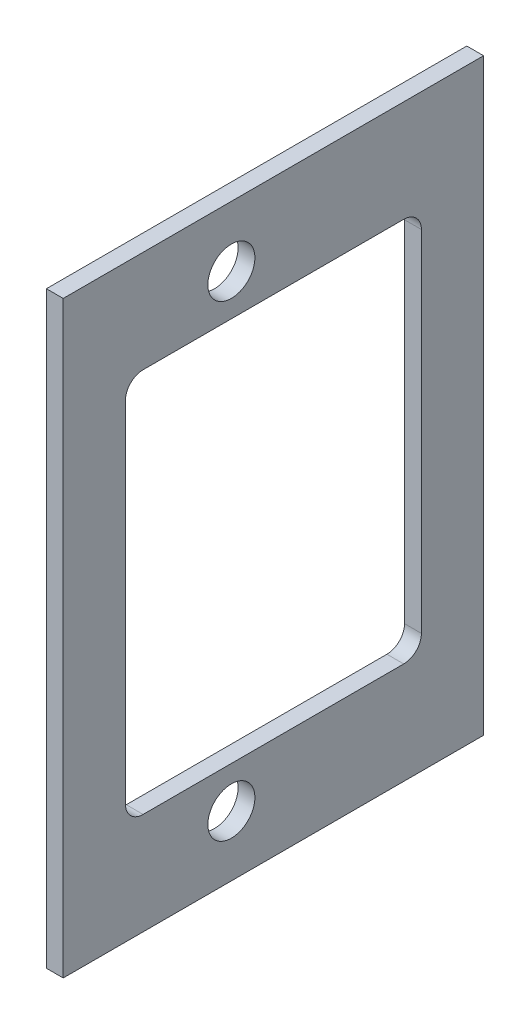
ISO-10303-21;
HEADER;
FILE_DESCRIPTION(('STEP AP214'),'2;1');
FILE_NAME('part.step','',(''),(''),'','','');
FILE_SCHEMA(('AUTOMOTIVE_DESIGN { 1 0 10303 214 1 1 1 1 }'));
ENDSEC;
DATA;
#1=APPLICATION_CONTEXT('core data for automotive mechanical design processes');
#2=APPLICATION_PROTOCOL_DEFINITION('international standard','automotive_design',2000,#1);
#3=PRODUCT_CONTEXT('',#1,'mechanical');
#4=PRODUCT('Part','Part','',(#3));
#5=PRODUCT_RELATED_PRODUCT_CATEGORY('part','',(#4));
#6=PRODUCT_DEFINITION_FORMATION('','',#4);
#7=PRODUCT_DEFINITION_CONTEXT('part definition',#1,'design');
#8=PRODUCT_DEFINITION('design','',#6,#7);
#9=PRODUCT_DEFINITION_SHAPE('','',#8);
#10=(LENGTH_UNIT() NAMED_UNIT(*) SI_UNIT(.MILLI.,.METRE.));
#11=(NAMED_UNIT(*) PLANE_ANGLE_UNIT() SI_UNIT($,.RADIAN.));
#12=(NAMED_UNIT(*) SI_UNIT($,.STERADIAN.) SOLID_ANGLE_UNIT());
#13=UNCERTAINTY_MEASURE_WITH_UNIT(LENGTH_MEASURE(1.E-05),#10,'distance_accuracy_value','');
#14=(GEOMETRIC_REPRESENTATION_CONTEXT(3) GLOBAL_UNCERTAINTY_ASSIGNED_CONTEXT((#13)) GLOBAL_UNIT_ASSIGNED_CONTEXT((#10,
#11,#12)) REPRESENTATION_CONTEXT('',''));
#15=CARTESIAN_POINT('',(0.,0.,0.));
#16=DIRECTION('',(0.,0.,1.));
#17=DIRECTION('',(1.,0.,0.));
#18=AXIS2_PLACEMENT_3D('',#15,#16,#17);
#19=CARTESIAN_POINT('',(1.,-17.5,12.5));
#20=DIRECTION('',(0.,0.,-1.));
#21=DIRECTION('',(-1.,0.,0.));
#22=AXIS2_PLACEMENT_3D('',#19,#20,#21);
#23=PLANE('',#22);
#24=DIRECTION('',(0.,-1.,0.));
#25=VECTOR('',#24,1.);
#26=CARTESIAN_POINT('',(0.,-17.5,12.5));
#27=LINE('',#26,#25);
#28=CARTESIAN_POINT('',(0.,17.5,12.5));
#29=VERTEX_POINT('',#28);
#30=CARTESIAN_POINT('',(0.,-17.5,12.5));
#31=VERTEX_POINT('',#30);
#32=EDGE_CURVE('E202',#29,#31,#27,.T.);
#33=ORIENTED_EDGE('',*,*,#32,.T.);
#34=DIRECTION('',(-1.,0.,0.));
#35=VECTOR('',#34,1.);
#36=CARTESIAN_POINT('',(1.,-17.5,12.5));
#37=LINE('',#36,#35);
#38=CARTESIAN_POINT('',(1.,-17.5,12.5));
#39=VERTEX_POINT('',#38);
#40=EDGE_CURVE('E11',#39,#31,#37,.T.);
#41=ORIENTED_EDGE('',*,*,#40,.F.);
#42=DIRECTION('',(0.,-1.,0.));
#43=VECTOR('',#42,1.);
#44=CARTESIAN_POINT('',(1.,-17.5,12.5));
#45=LINE('',#44,#43);
#46=CARTESIAN_POINT('',(1.,17.5,12.5));
#47=VERTEX_POINT('',#46);
#48=EDGE_CURVE('E203',#47,#39,#45,.T.);
#49=ORIENTED_EDGE('',*,*,#48,.F.);
#50=DIRECTION('',(-1.,0.,0.));
#51=VECTOR('',#50,1.);
#52=CARTESIAN_POINT('',(1.,17.5,12.5));
#53=LINE('',#52,#51);
#54=EDGE_CURVE('E217',#47,#29,#53,.T.);
#55=ORIENTED_EDGE('',*,*,#54,.T.);
#56=EDGE_LOOP('',(#33,#41,#49,#55));
#57=FACE_BOUND('',#56,.T.);
#58=ADVANCED_FACE('F38',(#57),#23,.F.);
#59=CARTESIAN_POINT('',(1.,-17.5,-12.5));
#60=DIRECTION('',(0.,1.,0.));
#61=DIRECTION('',(0.,0.,1.));
#62=AXIS2_PLACEMENT_3D('',#59,#60,#61);
#63=PLANE('',#62);
#64=DIRECTION('',(0.,0.,-1.));
#65=VECTOR('',#64,1.);
#66=CARTESIAN_POINT('',(0.,-17.5,-12.5));
#67=LINE('',#66,#65);
#68=CARTESIAN_POINT('',(0.,-17.5,-12.5));
#69=VERTEX_POINT('',#68);
#70=EDGE_CURVE('E221',#31,#69,#67,.T.);
#71=ORIENTED_EDGE('',*,*,#70,.T.);
#72=DIRECTION('',(-1.,0.,0.));
#73=VECTOR('',#72,1.);
#74=CARTESIAN_POINT('',(1.,-17.5,-12.5));
#75=LINE('',#74,#73);
#76=CARTESIAN_POINT('',(1.,-17.5,-12.5));
#77=VERTEX_POINT('',#76);
#78=EDGE_CURVE('E46',#77,#69,#75,.T.);
#79=ORIENTED_EDGE('',*,*,#78,.F.);
#80=DIRECTION('',(0.,0.,-1.));
#81=VECTOR('',#80,1.);
#82=CARTESIAN_POINT('',(1.,-17.5,-12.5));
#83=LINE('',#82,#81);
#84=EDGE_CURVE('E207',#39,#77,#83,.T.);
#85=ORIENTED_EDGE('',*,*,#84,.F.);
#86=ORIENTED_EDGE('',*,*,#40,.T.);
#87=EDGE_LOOP('',(#71,#79,#85,#86));
#88=FACE_BOUND('',#87,.T.);
#89=ADVANCED_FACE('F256',(#88),#63,.F.);
#90=CARTESIAN_POINT('',(1.,-17.5,-12.5));
#91=DIRECTION('',(0.,0.,1.));
#92=DIRECTION('',(1.,0.,0.));
#93=AXIS2_PLACEMENT_3D('',#90,#91,#92);
#94=PLANE('',#93);
#95=DIRECTION('',(0.,1.,0.));
#96=VECTOR('',#95,1.);
#97=CARTESIAN_POINT('',(0.,-17.5,-12.5));
#98=LINE('',#97,#96);
#99=CARTESIAN_POINT('',(0.,17.5,-12.5));
#100=VERTEX_POINT('',#99);
#101=EDGE_CURVE('E224',#69,#100,#98,.T.);
#102=ORIENTED_EDGE('',*,*,#101,.T.);
#103=DIRECTION('',(-1.,0.,0.));
#104=VECTOR('',#103,1.);
#105=CARTESIAN_POINT('',(1.,17.5,-12.5));
#106=LINE('',#105,#104);
#107=CARTESIAN_POINT('',(1.,17.5,-12.5));
#108=VERTEX_POINT('',#107);
#109=EDGE_CURVE('E232',#108,#100,#106,.T.);
#110=ORIENTED_EDGE('',*,*,#109,.F.);
#111=DIRECTION('',(0.,1.,0.));
#112=VECTOR('',#111,1.);
#113=CARTESIAN_POINT('',(1.,-17.5,-12.5));
#114=LINE('',#113,#112);
#115=EDGE_CURVE('E211',#77,#108,#114,.T.);
#116=ORIENTED_EDGE('',*,*,#115,.F.);
#117=ORIENTED_EDGE('',*,*,#78,.T.);
#118=EDGE_LOOP('',(#102,#110,#116,#117));
#119=FACE_BOUND('',#118,.T.);
#120=ADVANCED_FACE('F242',(#119),#94,.F.);
#121=CARTESIAN_POINT('',(1.,17.5,-12.5));
#122=DIRECTION('',(0.,-1.,0.));
#123=DIRECTION('',(0.,0.,-1.));
#124=AXIS2_PLACEMENT_3D('',#121,#122,#123);
#125=PLANE('',#124);
#126=DIRECTION('',(0.,0.,1.));
#127=VECTOR('',#126,1.);
#128=CARTESIAN_POINT('',(0.,17.5,-12.5));
#129=LINE('',#128,#127);
#130=EDGE_CURVE('E208',#100,#29,#129,.T.);
#131=ORIENTED_EDGE('',*,*,#130,.T.);
#132=ORIENTED_EDGE('',*,*,#54,.F.);
#133=DIRECTION('',(0.,0.,1.));
#134=VECTOR('',#133,1.);
#135=CARTESIAN_POINT('',(1.,17.5,-12.5));
#136=LINE('',#135,#134);
#137=EDGE_CURVE('E214',#108,#47,#136,.T.);
#138=ORIENTED_EDGE('',*,*,#137,.F.);
#139=ORIENTED_EDGE('',*,*,#109,.T.);
#140=EDGE_LOOP('',(#131,#132,#138,#139));
#141=FACE_BOUND('',#140,.T.);
#142=ADVANCED_FACE('F251',(#141),#125,.F.);
#143=CARTESIAN_POINT('',(1.,0.,0.));
#144=DIRECTION('',(1.,0.,0.));
#145=DIRECTION('',(0.,0.,-1.));
#146=AXIS2_PLACEMENT_3D('',#143,#144,#145);
#147=PLANE('',#146);
#148=CARTESIAN_POINT('',(1.,-13.8999999999999,2.5));
#149=DIRECTION('',(1.,0.,0.));
#150=DIRECTION('',(0.,0.,-1.));
#151=AXIS2_PLACEMENT_3D('',#148,#149,#150);
#152=CIRCLE('',#151,1.4);
#153=CARTESIAN_POINT('',(0.999999999999997,-13.8999999999999,3.9));
#154=VERTEX_POINT('',#153);
#155=EDGE_CURVE('E320',#154,#154,#152,.F.);
#156=ORIENTED_EDGE('',*,*,#155,.T.);
#157=EDGE_LOOP('',(#156));
#158=FACE_BOUND('',#157,.T.);
#159=CARTESIAN_POINT('',(1.,13.9,2.49999999999995));
#160=DIRECTION('',(1.,0.,0.));
#161=DIRECTION('',(0.,0.,-1.));
#162=AXIS2_PLACEMENT_3D('',#159,#160,#161);
#163=CIRCLE('',#162,1.40000000000004);
#164=CARTESIAN_POINT('',(0.999999999999997,13.9,3.89999999999999));
#165=VERTEX_POINT('',#164);
#166=EDGE_CURVE('E313',#165,#165,#163,.F.);
#167=ORIENTED_EDGE('',*,*,#166,.T.);
#168=EDGE_LOOP('',(#167));
#169=FACE_BOUND('',#168,.T.);
#170=DIRECTION('',(0.,0.,1.));
#171=VECTOR('',#170,1.);
#172=CARTESIAN_POINT('',(1.,-11.45,7.74999999999998));
#173=LINE('',#172,#171);
#174=CARTESIAN_POINT('',(1.,-11.45,-7.74999999999998));
#175=VERTEX_POINT('',#174);
#176=CARTESIAN_POINT('',(1.,-11.45,7.74999999999998));
#177=VERTEX_POINT('',#176);
#178=EDGE_CURVE('E142',#175,#177,#173,.T.);
#179=ORIENTED_EDGE('',*,*,#178,.T.);
#180=CARTESIAN_POINT('',(1.,-10.4,7.74999999999998));
#181=DIRECTION('',(1.,0.,0.));
#182=DIRECTION('',(0.,0.,-1.));
#183=AXIS2_PLACEMENT_3D('',#180,#181,#182);
#184=CIRCLE('',#183,1.04999999999999);
#185=CARTESIAN_POINT('',(1.,-10.4,8.79999999999997));
#186=VERTEX_POINT('',#185);
#187=EDGE_CURVE('E128',#177,#186,#184,.F.);
#188=ORIENTED_EDGE('',*,*,#187,.T.);
#189=DIRECTION('',(0.,1.,0.));
#190=VECTOR('',#189,1.);
#191=CARTESIAN_POINT('',(1.,10.4,8.79999999999997));
#192=LINE('',#191,#190);
#193=CARTESIAN_POINT('',(1.,10.4,8.79999999999997));
#194=VERTEX_POINT('',#193);
#195=EDGE_CURVE('E185',#186,#194,#192,.T.);
#196=ORIENTED_EDGE('',*,*,#195,.T.);
#197=CARTESIAN_POINT('',(1.,10.4,7.74999999999998));
#198=DIRECTION('',(1.,0.,0.));
#199=DIRECTION('',(0.,0.,-1.));
#200=AXIS2_PLACEMENT_3D('',#197,#198,#199);
#201=CIRCLE('',#200,1.05000000000002);
#202=CARTESIAN_POINT('',(1.,11.45,7.74999999999998));
#203=VERTEX_POINT('',#202);
#204=EDGE_CURVE('E180',#194,#203,#201,.F.);
#205=ORIENTED_EDGE('',*,*,#204,.T.);
#206=DIRECTION('',(0.,0.,-1.));
#207=VECTOR('',#206,1.);
#208=CARTESIAN_POINT('',(1.,11.45,-7.75000000000003));
#209=LINE('',#208,#207);
#210=CARTESIAN_POINT('',(1.,11.45,-7.75000000000003));
#211=VERTEX_POINT('',#210);
#212=EDGE_CURVE('E175',#203,#211,#209,.T.);
#213=ORIENTED_EDGE('',*,*,#212,.T.);
#214=CARTESIAN_POINT('',(1.,10.4,-7.75000000000003));
#215=DIRECTION('',(1.,0.,0.));
#216=DIRECTION('',(0.,0.,-1.));
#217=AXIS2_PLACEMENT_3D('',#214,#215,#216);
#218=CIRCLE('',#217,1.05);
#219=CARTESIAN_POINT('',(1.,10.4,-8.80000000000003));
#220=VERTEX_POINT('',#219);
#221=EDGE_CURVE('E170',#211,#220,#218,.F.);
#222=ORIENTED_EDGE('',*,*,#221,.T.);
#223=DIRECTION('',(0.,-1.,0.));
#224=VECTOR('',#223,1.);
#225=CARTESIAN_POINT('',(1.,10.4,-8.80000000000003));
#226=LINE('',#225,#224);
#227=CARTESIAN_POINT('',(1.,-10.4,-8.80000000000003));
#228=VERTEX_POINT('',#227);
#229=EDGE_CURVE('E166',#220,#228,#226,.T.);
#230=ORIENTED_EDGE('',*,*,#229,.T.);
#231=CARTESIAN_POINT('',(1.,-10.4,-7.75000000000003));
#232=DIRECTION('',(1.,0.,0.));
#233=DIRECTION('',(0.,0.,-1.));
#234=AXIS2_PLACEMENT_3D('',#231,#232,#233);
#235=CIRCLE('',#234,1.05);
#236=EDGE_CURVE('E152',#228,#175,#235,.F.);
#237=ORIENTED_EDGE('',*,*,#236,.T.);
#238=EDGE_LOOP('',(#179,#188,#196,#205,#213,#222,#230,#237));
#239=FACE_BOUND('',#238,.T.);
#240=ORIENTED_EDGE('',*,*,#48,.T.);
#241=ORIENTED_EDGE('',*,*,#84,.T.);
#242=ORIENTED_EDGE('',*,*,#115,.T.);
#243=ORIENTED_EDGE('',*,*,#137,.T.);
#244=EDGE_LOOP('',(#240,#241,#242,#243));
#245=FACE_BOUND('',#244,.T.);
#246=ADVANCED_FACE('F149',(#158,#169,#239,#245),#147,.T.);
#247=CARTESIAN_POINT('',(0.,0.,0.));
#248=DIRECTION('',(1.,0.,0.));
#249=DIRECTION('',(0.,0.,-1.));
#250=AXIS2_PLACEMENT_3D('',#247,#248,#249);
#251=PLANE('',#250);
#252=CARTESIAN_POINT('',(0.,-13.8999999999999,2.5));
#253=DIRECTION('',(-1.,0.,0.));
#254=DIRECTION('',(0.,0.,1.));
#255=AXIS2_PLACEMENT_3D('',#252,#253,#254);
#256=CIRCLE('',#255,1.4);
#257=CARTESIAN_POINT('',(0.,-13.8999999999999,3.9));
#258=VERTEX_POINT('',#257);
#259=EDGE_CURVE('E323',#258,#258,#256,.T.);
#260=ORIENTED_EDGE('',*,*,#259,.F.);
#261=EDGE_LOOP('',(#260));
#262=FACE_BOUND('',#261,.T.);
#263=CARTESIAN_POINT('',(0.,13.9,2.49999999999995));
#264=DIRECTION('',(-1.,0.,0.));
#265=DIRECTION('',(0.,0.,1.));
#266=AXIS2_PLACEMENT_3D('',#263,#264,#265);
#267=CIRCLE('',#266,1.40000000000004);
#268=CARTESIAN_POINT('',(0.,13.9,3.89999999999999));
#269=VERTEX_POINT('',#268);
#270=EDGE_CURVE('E310',#269,#269,#267,.T.);
#271=ORIENTED_EDGE('',*,*,#270,.F.);
#272=EDGE_LOOP('',(#271));
#273=FACE_BOUND('',#272,.T.);
#274=CARTESIAN_POINT('',(0.,-10.4,7.74999999999998));
#275=DIRECTION('',(-1.,0.,0.));
#276=DIRECTION('',(0.,0.,1.));
#277=AXIS2_PLACEMENT_3D('',#274,#275,#276);
#278=CIRCLE('',#277,1.04999999999999);
#279=CARTESIAN_POINT('',(0.,-11.45,7.74999999999998));
#280=VERTEX_POINT('',#279);
#281=CARTESIAN_POINT('',(0.,-10.4,8.79999999999997));
#282=VERTEX_POINT('',#281);
#283=EDGE_CURVE('E345',#280,#282,#278,.T.);
#284=ORIENTED_EDGE('',*,*,#283,.F.);
#285=DIRECTION('',(0.,0.,1.));
#286=VECTOR('',#285,1.);
#287=CARTESIAN_POINT('',(0.,-11.45,7.74999999999998));
#288=LINE('',#287,#286);
#289=CARTESIAN_POINT('',(0.,-11.45,-7.74999999999998));
#290=VERTEX_POINT('',#289);
#291=EDGE_CURVE('E145',#290,#280,#288,.T.);
#292=ORIENTED_EDGE('',*,*,#291,.F.);
#293=CARTESIAN_POINT('',(0.,-10.4,-7.75000000000003));
#294=DIRECTION('',(-1.,0.,0.));
#295=DIRECTION('',(0.,0.,1.));
#296=AXIS2_PLACEMENT_3D('',#293,#294,#295);
#297=CIRCLE('',#296,1.05);
#298=CARTESIAN_POINT('',(0.,-10.4,-8.80000000000003));
#299=VERTEX_POINT('',#298);
#300=EDGE_CURVE('E161',#299,#290,#297,.T.);
#301=ORIENTED_EDGE('',*,*,#300,.F.);
#302=DIRECTION('',(0.,-1.,0.));
#303=VECTOR('',#302,1.);
#304=CARTESIAN_POINT('',(0.,10.4,-8.80000000000003));
#305=LINE('',#304,#303);
#306=CARTESIAN_POINT('',(0.,10.4,-8.80000000000003));
#307=VERTEX_POINT('',#306);
#308=EDGE_CURVE('E61',#307,#299,#305,.T.);
#309=ORIENTED_EDGE('',*,*,#308,.F.);
#310=CARTESIAN_POINT('',(0.,10.4,-7.75000000000003));
#311=DIRECTION('',(-1.,0.,0.));
#312=DIRECTION('',(0.,0.,1.));
#313=AXIS2_PLACEMENT_3D('',#310,#311,#312);
#314=CIRCLE('',#313,1.05);
#315=CARTESIAN_POINT('',(0.,11.45,-7.75000000000003));
#316=VERTEX_POINT('',#315);
#317=EDGE_CURVE('E157',#316,#307,#314,.T.);
#318=ORIENTED_EDGE('',*,*,#317,.F.);
#319=DIRECTION('',(0.,0.,-1.));
#320=VECTOR('',#319,1.);
#321=CARTESIAN_POINT('',(0.,11.45,-7.75000000000003));
#322=LINE('',#321,#320);
#323=CARTESIAN_POINT('',(0.,11.45,7.74999999999998));
#324=VERTEX_POINT('',#323);
#325=EDGE_CURVE('E333',#324,#316,#322,.T.);
#326=ORIENTED_EDGE('',*,*,#325,.F.);
#327=CARTESIAN_POINT('',(0.,10.4,7.74999999999998));
#328=DIRECTION('',(-1.,0.,0.));
#329=DIRECTION('',(0.,0.,1.));
#330=AXIS2_PLACEMENT_3D('',#327,#328,#329);
#331=CIRCLE('',#330,1.05000000000002);
#332=CARTESIAN_POINT('',(0.,10.4,8.79999999999997));
#333=VERTEX_POINT('',#332);
#334=EDGE_CURVE('E337',#333,#324,#331,.T.);
#335=ORIENTED_EDGE('',*,*,#334,.F.);
#336=DIRECTION('',(0.,1.,0.));
#337=VECTOR('',#336,1.);
#338=CARTESIAN_POINT('',(0.,10.4,8.79999999999997));
#339=LINE('',#338,#337);
#340=EDGE_CURVE('E341',#282,#333,#339,.T.);
#341=ORIENTED_EDGE('',*,*,#340,.F.);
#342=EDGE_LOOP('',(#284,#292,#301,#309,#318,#326,#335,#341));
#343=FACE_BOUND('',#342,.T.);
#344=ORIENTED_EDGE('',*,*,#32,.F.);
#345=ORIENTED_EDGE('',*,*,#130,.F.);
#346=ORIENTED_EDGE('',*,*,#101,.F.);
#347=ORIENTED_EDGE('',*,*,#70,.F.);
#348=EDGE_LOOP('',(#344,#345,#346,#347));
#349=FACE_BOUND('',#348,.T.);
#350=ADVANCED_FACE('F248',(#262,#273,#343,#349),#251,.F.);
#351=CARTESIAN_POINT('',(29.8820013156984,-11.45,7.74999999999998));
#352=DIRECTION('',(0.,-1.,0.));
#353=DIRECTION('',(0.,0.,-1.));
#354=AXIS2_PLACEMENT_3D('',#351,#352,#353);
#355=PLANE('',#354);
#356=DIRECTION('',(-1.,0.,0.));
#357=VECTOR('',#356,1.);
#358=CARTESIAN_POINT('',(29.8820013156984,-11.45,-7.74999999999998));
#359=LINE('',#358,#357);
#360=EDGE_CURVE('E53',#175,#290,#359,.T.);
#361=ORIENTED_EDGE('',*,*,#360,.T.);
#362=ORIENTED_EDGE('',*,*,#291,.T.);
#363=DIRECTION('',(-1.,0.,0.));
#364=VECTOR('',#363,1.);
#365=CARTESIAN_POINT('',(29.8820013156984,-11.45,7.74999999999998));
#366=LINE('',#365,#364);
#367=EDGE_CURVE('E132',#177,#280,#366,.T.);
#368=ORIENTED_EDGE('',*,*,#367,.F.);
#369=ORIENTED_EDGE('',*,*,#178,.F.);
#370=EDGE_LOOP('',(#361,#362,#368,#369));
#371=FACE_BOUND('',#370,.T.);
#372=ADVANCED_FACE('F141',(#371),#355,.F.);
#373=CARTESIAN_POINT('',(29.8820013156984,-10.4,7.74999999999998));
#374=DIRECTION('',(-1.,0.,0.));
#375=DIRECTION('',(0.,0.,1.));
#376=AXIS2_PLACEMENT_3D('',#373,#374,#375);
#377=CYLINDRICAL_SURFACE('',#376,1.04999999999999);
#378=ORIENTED_EDGE('',*,*,#367,.T.);
#379=ORIENTED_EDGE('',*,*,#283,.T.);
#380=DIRECTION('',(-1.,0.,0.));
#381=VECTOR('',#380,1.);
#382=CARTESIAN_POINT('',(29.8820013156984,-10.4,8.79999999999997));
#383=LINE('',#382,#381);
#384=EDGE_CURVE('E134',#186,#282,#383,.T.);
#385=ORIENTED_EDGE('',*,*,#384,.F.);
#386=ORIENTED_EDGE('',*,*,#187,.F.);
#387=EDGE_LOOP('',(#378,#379,#385,#386));
#388=FACE_BOUND('',#387,.T.);
#389=ADVANCED_FACE('F130',(#388),#377,.F.);
#390=CARTESIAN_POINT('',(29.8820013156984,10.4,8.79999999999997));
#391=DIRECTION('',(0.,0.,1.));
#392=DIRECTION('',(0.,-1.,0.));
#393=AXIS2_PLACEMENT_3D('',#390,#391,#392);
#394=PLANE('',#393);
#395=ORIENTED_EDGE('',*,*,#384,.T.);
#396=ORIENTED_EDGE('',*,*,#340,.T.);
#397=DIRECTION('',(-1.,0.,0.));
#398=VECTOR('',#397,1.);
#399=CARTESIAN_POINT('',(29.8820013156984,10.4,8.79999999999997));
#400=LINE('',#399,#398);
#401=EDGE_CURVE('E184',#194,#333,#400,.T.);
#402=ORIENTED_EDGE('',*,*,#401,.F.);
#403=ORIENTED_EDGE('',*,*,#195,.F.);
#404=EDGE_LOOP('',(#395,#396,#402,#403));
#405=FACE_BOUND('',#404,.T.);
#406=ADVANCED_FACE('F276',(#405),#394,.F.);
#407=CARTESIAN_POINT('',(29.8820013156984,10.4,7.74999999999998));
#408=DIRECTION('',(-1.,0.,0.));
#409=DIRECTION('',(0.,0.,1.));
#410=AXIS2_PLACEMENT_3D('',#407,#408,#409);
#411=CYLINDRICAL_SURFACE('',#410,1.05000000000002);
#412=ORIENTED_EDGE('',*,*,#401,.T.);
#413=ORIENTED_EDGE('',*,*,#334,.T.);
#414=DIRECTION('',(-1.,0.,0.));
#415=VECTOR('',#414,1.);
#416=CARTESIAN_POINT('',(29.8820013156984,11.45,7.74999999999998));
#417=LINE('',#416,#415);
#418=EDGE_CURVE('E179',#203,#324,#417,.T.);
#419=ORIENTED_EDGE('',*,*,#418,.F.);
#420=ORIENTED_EDGE('',*,*,#204,.F.);
#421=EDGE_LOOP('',(#412,#413,#419,#420));
#422=FACE_BOUND('',#421,.T.);
#423=ADVANCED_FACE('F279',(#422),#411,.F.);
#424=CARTESIAN_POINT('',(29.8820013156984,11.45,-7.75000000000003));
#425=DIRECTION('',(0.,1.,0.));
#426=DIRECTION('',(0.,0.,1.));
#427=AXIS2_PLACEMENT_3D('',#424,#425,#426);
#428=PLANE('',#427);
#429=ORIENTED_EDGE('',*,*,#418,.T.);
#430=ORIENTED_EDGE('',*,*,#325,.T.);
#431=DIRECTION('',(-1.,0.,0.));
#432=VECTOR('',#431,1.);
#433=CARTESIAN_POINT('',(29.8820013156984,11.45,-7.75000000000003));
#434=LINE('',#433,#432);
#435=EDGE_CURVE('E174',#211,#316,#434,.T.);
#436=ORIENTED_EDGE('',*,*,#435,.F.);
#437=ORIENTED_EDGE('',*,*,#212,.F.);
#438=EDGE_LOOP('',(#429,#430,#436,#437));
#439=FACE_BOUND('',#438,.T.);
#440=ADVANCED_FACE('F283',(#439),#428,.F.);
#441=CARTESIAN_POINT('',(29.8820013156984,10.4,-7.75000000000003));
#442=DIRECTION('',(-1.,0.,0.));
#443=DIRECTION('',(0.,0.,1.));
#444=AXIS2_PLACEMENT_3D('',#441,#442,#443);
#445=CYLINDRICAL_SURFACE('',#444,1.05);
#446=ORIENTED_EDGE('',*,*,#435,.T.);
#447=ORIENTED_EDGE('',*,*,#317,.T.);
#448=DIRECTION('',(-1.,0.,0.));
#449=VECTOR('',#448,1.);
#450=CARTESIAN_POINT('',(29.8820013156984,10.4,-8.80000000000003));
#451=LINE('',#450,#449);
#452=EDGE_CURVE('E169',#220,#307,#451,.T.);
#453=ORIENTED_EDGE('',*,*,#452,.F.);
#454=ORIENTED_EDGE('',*,*,#221,.F.);
#455=EDGE_LOOP('',(#446,#447,#453,#454));
#456=FACE_BOUND('',#455,.T.);
#457=ADVANCED_FACE('F287',(#456),#445,.F.);
#458=CARTESIAN_POINT('',(29.8820013156984,10.4,-8.80000000000003));
#459=DIRECTION('',(0.,0.,-1.));
#460=DIRECTION('',(0.,1.,0.));
#461=AXIS2_PLACEMENT_3D('',#458,#459,#460);
#462=PLANE('',#461);
#463=ORIENTED_EDGE('',*,*,#452,.T.);
#464=ORIENTED_EDGE('',*,*,#308,.T.);
#465=DIRECTION('',(-1.,0.,0.));
#466=VECTOR('',#465,1.);
#467=CARTESIAN_POINT('',(29.8820013156984,-10.4,-8.80000000000003));
#468=LINE('',#467,#466);
#469=EDGE_CURVE('E165',#228,#299,#468,.T.);
#470=ORIENTED_EDGE('',*,*,#469,.F.);
#471=ORIENTED_EDGE('',*,*,#229,.F.);
#472=EDGE_LOOP('',(#463,#464,#470,#471));
#473=FACE_BOUND('',#472,.T.);
#474=ADVANCED_FACE('F291',(#473),#462,.F.);
#475=CARTESIAN_POINT('',(29.8820013156984,-10.4,-7.75000000000003));
#476=DIRECTION('',(-1.,0.,0.));
#477=DIRECTION('',(0.,0.,1.));
#478=AXIS2_PLACEMENT_3D('',#475,#476,#477);
#479=CYLINDRICAL_SURFACE('',#478,1.05);
#480=ORIENTED_EDGE('',*,*,#469,.T.);
#481=ORIENTED_EDGE('',*,*,#300,.T.);
#482=ORIENTED_EDGE('',*,*,#360,.F.);
#483=ORIENTED_EDGE('',*,*,#236,.F.);
#484=EDGE_LOOP('',(#480,#481,#482,#483));
#485=FACE_BOUND('',#484,.T.);
#486=ADVANCED_FACE('F295',(#485),#479,.F.);
#487=CARTESIAN_POINT('',(29.8820013156984,13.9,2.49999999999995));
#488=DIRECTION('',(-1.,0.,0.));
#489=DIRECTION('',(0.,0.,1.));
#490=AXIS2_PLACEMENT_3D('',#487,#488,#489);
#491=CYLINDRICAL_SURFACE('',#490,1.40000000000004);
#492=CARTESIAN_POINT('',(0.,13.9,3.89999999999999));
#493=CARTESIAN_POINT('',(0.0104166666666701,13.9,3.89999999999999));
#494=CARTESIAN_POINT('',(0.0208333333333368,13.9,3.89999999999999));
#495=CARTESIAN_POINT('',(0.0416666666666702,13.9,3.89999999999999));
#496=CARTESIAN_POINT('',(0.0520833333333369,13.9,3.89999999999999));
#497=CARTESIAN_POINT('',(0.0729166666666702,13.9,3.89999999999999));
#498=CARTESIAN_POINT('',(0.0833333333333369,13.9,3.89999999999999));
#499=CARTESIAN_POINT('',(0.10416666666667,13.9,3.89999999999999));
#500=CARTESIAN_POINT('',(0.114583333333337,13.9,3.89999999999999));
#501=CARTESIAN_POINT('',(0.13541666666667,13.9,3.89999999999999));
#502=CARTESIAN_POINT('',(0.145833333333337,13.9,3.89999999999999));
#503=CARTESIAN_POINT('',(0.16666666666667,13.9,3.89999999999999));
#504=CARTESIAN_POINT('',(0.177083333333337,13.9,3.89999999999999));
#505=CARTESIAN_POINT('',(0.19791666666667,13.9,3.89999999999999));
#506=CARTESIAN_POINT('',(0.208333333333337,13.9,3.89999999999999));
#507=CARTESIAN_POINT('',(0.22916666666667,13.9,3.89999999999999));
#508=CARTESIAN_POINT('',(0.239583333333337,13.9,3.89999999999999));
#509=CARTESIAN_POINT('',(0.260416666666669,13.9,3.89999999999999));
#510=CARTESIAN_POINT('',(0.270833333333335,13.9,3.89999999999999));
#511=CARTESIAN_POINT('',(0.291666666666667,13.9,3.89999999999999));
#512=CARTESIAN_POINT('',(0.302083333333334,13.9,3.89999999999999));
#513=CARTESIAN_POINT('',(0.322916666666667,13.9,3.89999999999999));
#514=CARTESIAN_POINT('',(0.333333333333334,13.9,3.89999999999999));
#515=CARTESIAN_POINT('',(0.354166666666667,13.9,3.89999999999999));
#516=CARTESIAN_POINT('',(0.364583333333334,13.9,3.89999999999999));
#517=CARTESIAN_POINT('',(0.385416666666667,13.9,3.89999999999999));
#518=CARTESIAN_POINT('',(0.395833333333334,13.9,3.89999999999999));
#519=CARTESIAN_POINT('',(0.416666666666667,13.9,3.89999999999999));
#520=CARTESIAN_POINT('',(0.427083333333334,13.9,3.89999999999999));
#521=CARTESIAN_POINT('',(0.447916666666667,13.9,3.89999999999999));
#522=CARTESIAN_POINT('',(0.458333333333334,13.9,3.89999999999999));
#523=CARTESIAN_POINT('',(0.479166666666667,13.9,3.89999999999999));
#524=CARTESIAN_POINT('',(0.489583333333334,13.9,3.89999999999999));
#525=CARTESIAN_POINT('',(0.510416666666667,13.9,3.89999999999999));
#526=CARTESIAN_POINT('',(0.520833333333334,13.9,3.89999999999999));
#527=CARTESIAN_POINT('',(0.541666666666667,13.9,3.89999999999999));
#528=CARTESIAN_POINT('',(0.552083333333334,13.9,3.89999999999999));
#529=CARTESIAN_POINT('',(0.572916666666667,13.9,3.89999999999999));
#530=CARTESIAN_POINT('',(0.583333333333334,13.9,3.89999999999999));
#531=CARTESIAN_POINT('',(0.604166666666667,13.9,3.89999999999999));
#532=CARTESIAN_POINT('',(0.614583333333334,13.9,3.89999999999999));
#533=CARTESIAN_POINT('',(0.635416666666667,13.9,3.89999999999999));
#534=CARTESIAN_POINT('',(0.645833333333334,13.9,3.89999999999999));
#535=CARTESIAN_POINT('',(0.666666666666667,13.9,3.89999999999999));
#536=CARTESIAN_POINT('',(0.677083333333334,13.9,3.89999999999999));
#537=CARTESIAN_POINT('',(0.697916666666667,13.9,3.89999999999999));
#538=CARTESIAN_POINT('',(0.708333333333334,13.9,3.89999999999999));
#539=CARTESIAN_POINT('',(0.729166666666666,13.9,3.89999999999999));
#540=CARTESIAN_POINT('',(0.739583333333332,13.9,3.89999999999999));
#541=CARTESIAN_POINT('',(0.760416666666664,13.9,3.89999999999999));
#542=CARTESIAN_POINT('',(0.77083333333333,13.9,3.89999999999999));
#543=CARTESIAN_POINT('',(0.791666666666664,13.9,3.89999999999999));
#544=CARTESIAN_POINT('',(0.802083333333331,13.9,3.89999999999999));
#545=CARTESIAN_POINT('',(0.822916666666664,13.9,3.89999999999999));
#546=CARTESIAN_POINT('',(0.833333333333331,13.9,3.89999999999999));
#547=CARTESIAN_POINT('',(0.854166666666664,13.9,3.89999999999999));
#548=CARTESIAN_POINT('',(0.864583333333331,13.9,3.89999999999999));
#549=CARTESIAN_POINT('',(0.885416666666664,13.9,3.89999999999999));
#550=CARTESIAN_POINT('',(0.895833333333331,13.9,3.89999999999999));
#551=CARTESIAN_POINT('',(0.916666666666664,13.9,3.89999999999999));
#552=CARTESIAN_POINT('',(0.927083333333331,13.9,3.89999999999999));
#553=CARTESIAN_POINT('',(0.947916666666664,13.9,3.89999999999999));
#554=CARTESIAN_POINT('',(0.958333333333331,13.9,3.89999999999999));
#555=CARTESIAN_POINT('',(0.979166666666664,13.9,3.89999999999999));
#556=CARTESIAN_POINT('',(0.989583333333331,13.9,3.89999999999999));
#557=CARTESIAN_POINT('',(0.999999999999997,13.9,3.89999999999999));
#558=B_SPLINE_CURVE_WITH_KNOTS('',3,(#492,#493,#494,#495,#496,#497,#498,#499,#500,#501,#502,
#503,#504,#505,#506,#507,#508,#509,#510,#511,#512,#513,#514,#515,#516,#517,#518,#519,#520,#521,
#522,#523,#524,#525,#526,#527,#528,#529,#530,#531,#532,#533,#534,#535,#536,#537,#538,#539,#540,
#541,#542,#543,#544,#545,#546,#547,#548,#549,#550,#551,#552,#553,#554,#555,#556,#557),
.UNSPECIFIED.,.F.,.F.,(4,2,2,2,2,2,2,2,2,2,2,2,2,2,2,2,2,2,2,2,2,2,2,2,2,2,2,2,2,2,2,2,4),(0.,
0.03125,0.0625000000000001,0.0937500000000001,0.125,0.15625,0.1875,0.21875,0.25,
0.281249999999997,0.312499999999997,0.343749999999997,0.374999999999997,0.406249999999997,
0.437499999999997,0.468749999999997,0.499999999999997,0.531249999999997,0.562499999999997,
0.593749999999997,0.624999999999997,0.656249999999997,0.687499999999997,0.718749999999997,
0.749999999999994,0.781249999999994,0.812499999999994,0.843749999999994,0.874999999999994,
0.906249999999994,0.937499999999994,0.968749999999994,0.999999999999994),.UNSPECIFIED.);
#559=EDGE_CURVE('BSEAM298',#269,#165,#558,.T.);
#560=ORIENTED_EDGE('',*,*,#270,.T.);
#561=ORIENTED_EDGE('',*,*,#166,.F.);
#562=ORIENTED_EDGE('',*,*,#559,.T.);
#563=ORIENTED_EDGE('',*,*,#559,.F.);
#564=EDGE_LOOP('',(#560,#562,#561,#563));
#565=FACE_BOUND('',#564,.T.);
#566=ADVANCED_FACE('F298',(#565),#491,.F.);
#567=CARTESIAN_POINT('',(29.8820013156984,-13.8999999999999,2.5));
#568=DIRECTION('',(-1.,0.,0.));
#569=DIRECTION('',(0.,0.,1.));
#570=AXIS2_PLACEMENT_3D('',#567,#568,#569);
#571=CYLINDRICAL_SURFACE('',#570,1.4);
#572=CARTESIAN_POINT('',(0.,-13.8999999999999,3.9));
#573=CARTESIAN_POINT('',(0.0104166666666701,-13.8999999999999,3.9));
#574=CARTESIAN_POINT('',(0.0208333333333368,-13.8999999999999,3.9));
#575=CARTESIAN_POINT('',(0.0416666666666702,-13.8999999999999,3.9));
#576=CARTESIAN_POINT('',(0.0520833333333369,-13.8999999999999,3.9));
#577=CARTESIAN_POINT('',(0.0729166666666702,-13.8999999999999,3.9));
#578=CARTESIAN_POINT('',(0.0833333333333369,-13.8999999999999,3.9));
#579=CARTESIAN_POINT('',(0.10416666666667,-13.8999999999999,3.9));
#580=CARTESIAN_POINT('',(0.114583333333337,-13.8999999999999,3.9));
#581=CARTESIAN_POINT('',(0.13541666666667,-13.8999999999999,3.9));
#582=CARTESIAN_POINT('',(0.145833333333337,-13.8999999999999,3.9));
#583=CARTESIAN_POINT('',(0.16666666666667,-13.8999999999999,3.9));
#584=CARTESIAN_POINT('',(0.177083333333337,-13.8999999999999,3.9));
#585=CARTESIAN_POINT('',(0.19791666666667,-13.8999999999999,3.9));
#586=CARTESIAN_POINT('',(0.208333333333337,-13.8999999999999,3.9));
#587=CARTESIAN_POINT('',(0.22916666666667,-13.8999999999999,3.9));
#588=CARTESIAN_POINT('',(0.239583333333337,-13.8999999999999,3.9));
#589=CARTESIAN_POINT('',(0.260416666666669,-13.8999999999999,3.9));
#590=CARTESIAN_POINT('',(0.270833333333335,-13.8999999999999,3.9));
#591=CARTESIAN_POINT('',(0.291666666666667,-13.8999999999999,3.9));
#592=CARTESIAN_POINT('',(0.302083333333334,-13.8999999999999,3.9));
#593=CARTESIAN_POINT('',(0.322916666666667,-13.8999999999999,3.9));
#594=CARTESIAN_POINT('',(0.333333333333334,-13.8999999999999,3.9));
#595=CARTESIAN_POINT('',(0.354166666666667,-13.8999999999999,3.9));
#596=CARTESIAN_POINT('',(0.364583333333334,-13.8999999999999,3.9));
#597=CARTESIAN_POINT('',(0.385416666666667,-13.8999999999999,3.9));
#598=CARTESIAN_POINT('',(0.395833333333334,-13.8999999999999,3.9));
#599=CARTESIAN_POINT('',(0.416666666666667,-13.8999999999999,3.9));
#600=CARTESIAN_POINT('',(0.427083333333334,-13.8999999999999,3.9));
#601=CARTESIAN_POINT('',(0.447916666666667,-13.8999999999999,3.9));
#602=CARTESIAN_POINT('',(0.458333333333334,-13.8999999999999,3.9));
#603=CARTESIAN_POINT('',(0.479166666666667,-13.8999999999999,3.9));
#604=CARTESIAN_POINT('',(0.489583333333334,-13.8999999999999,3.9));
#605=CARTESIAN_POINT('',(0.510416666666667,-13.8999999999999,3.9));
#606=CARTESIAN_POINT('',(0.520833333333334,-13.8999999999999,3.9));
#607=CARTESIAN_POINT('',(0.541666666666667,-13.8999999999999,3.9));
#608=CARTESIAN_POINT('',(0.552083333333334,-13.8999999999999,3.9));
#609=CARTESIAN_POINT('',(0.572916666666667,-13.8999999999999,3.9));
#610=CARTESIAN_POINT('',(0.583333333333334,-13.8999999999999,3.9));
#611=CARTESIAN_POINT('',(0.604166666666667,-13.8999999999999,3.9));
#612=CARTESIAN_POINT('',(0.614583333333334,-13.8999999999999,3.9));
#613=CARTESIAN_POINT('',(0.635416666666667,-13.8999999999999,3.9));
#614=CARTESIAN_POINT('',(0.645833333333334,-13.8999999999999,3.9));
#615=CARTESIAN_POINT('',(0.666666666666667,-13.8999999999999,3.9));
#616=CARTESIAN_POINT('',(0.677083333333334,-13.8999999999999,3.9));
#617=CARTESIAN_POINT('',(0.697916666666667,-13.8999999999999,3.9));
#618=CARTESIAN_POINT('',(0.708333333333334,-13.8999999999999,3.9));
#619=CARTESIAN_POINT('',(0.729166666666666,-13.8999999999999,3.9));
#620=CARTESIAN_POINT('',(0.739583333333332,-13.8999999999999,3.9));
#621=CARTESIAN_POINT('',(0.760416666666664,-13.8999999999999,3.9));
#622=CARTESIAN_POINT('',(0.77083333333333,-13.8999999999999,3.9));
#623=CARTESIAN_POINT('',(0.791666666666664,-13.8999999999999,3.9));
#624=CARTESIAN_POINT('',(0.802083333333331,-13.8999999999999,3.9));
#625=CARTESIAN_POINT('',(0.822916666666664,-13.8999999999999,3.9));
#626=CARTESIAN_POINT('',(0.833333333333331,-13.8999999999999,3.9));
#627=CARTESIAN_POINT('',(0.854166666666664,-13.8999999999999,3.9));
#628=CARTESIAN_POINT('',(0.864583333333331,-13.8999999999999,3.9));
#629=CARTESIAN_POINT('',(0.885416666666664,-13.8999999999999,3.9));
#630=CARTESIAN_POINT('',(0.895833333333331,-13.8999999999999,3.9));
#631=CARTESIAN_POINT('',(0.916666666666664,-13.8999999999999,3.9));
#632=CARTESIAN_POINT('',(0.927083333333331,-13.8999999999999,3.9));
#633=CARTESIAN_POINT('',(0.947916666666664,-13.8999999999999,3.9));
#634=CARTESIAN_POINT('',(0.958333333333331,-13.8999999999999,3.9));
#635=CARTESIAN_POINT('',(0.979166666666664,-13.8999999999999,3.9));
#636=CARTESIAN_POINT('',(0.989583333333331,-13.8999999999999,3.9));
#637=CARTESIAN_POINT('',(0.999999999999997,-13.8999999999999,3.9));
#638=B_SPLINE_CURVE_WITH_KNOTS('',3,(#572,#573,#574,#575,#576,#577,#578,#579,#580,#581,#582,
#583,#584,#585,#586,#587,#588,#589,#590,#591,#592,#593,#594,#595,#596,#597,#598,#599,#600,#601,
#602,#603,#604,#605,#606,#607,#608,#609,#610,#611,#612,#613,#614,#615,#616,#617,#618,#619,#620,
#621,#622,#623,#624,#625,#626,#627,#628,#629,#630,#631,#632,#633,#634,#635,#636,#637),
.UNSPECIFIED.,.F.,.F.,(4,2,2,2,2,2,2,2,2,2,2,2,2,2,2,2,2,2,2,2,2,2,2,2,2,2,2,2,2,2,2,2,4),(0.,
0.03125,0.0625000000000001,0.0937500000000001,0.125,0.15625,0.1875,0.21875,0.25,
0.281249999999997,0.312499999999997,0.343749999999997,0.374999999999997,0.406249999999997,
0.437499999999997,0.468749999999997,0.499999999999997,0.531249999999997,0.562499999999997,
0.593749999999997,0.624999999999997,0.656249999999997,0.687499999999997,0.718749999999997,
0.749999999999994,0.781249999999994,0.812499999999994,0.843749999999994,0.874999999999994,
0.906249999999994,0.937499999999994,0.968749999999994,0.999999999999994),.UNSPECIFIED.);
#639=EDGE_CURVE('BSEAM299',#258,#154,#638,.T.);
#640=ORIENTED_EDGE('',*,*,#259,.T.);
#641=ORIENTED_EDGE('',*,*,#155,.F.);
#642=ORIENTED_EDGE('',*,*,#639,.T.);
#643=ORIENTED_EDGE('',*,*,#639,.F.);
#644=EDGE_LOOP('',(#640,#642,#641,#643));
#645=FACE_BOUND('',#644,.T.);
#646=ADVANCED_FACE('F299',(#645),#571,.F.);
#647=CLOSED_SHELL('',(#58,#89,#120,#142,#246,#350,#372,#389,#406,#423,#440,#457,#474,#486,#566,#646));
#648=MANIFOLD_SOLID_BREP('B2',#647);
#649=ADVANCED_BREP_SHAPE_REPRESENTATION('',(#18,#648),#14);
#650=SHAPE_DEFINITION_REPRESENTATION(#9,#649);
ENDSEC;
END-ISO-10303-21;
